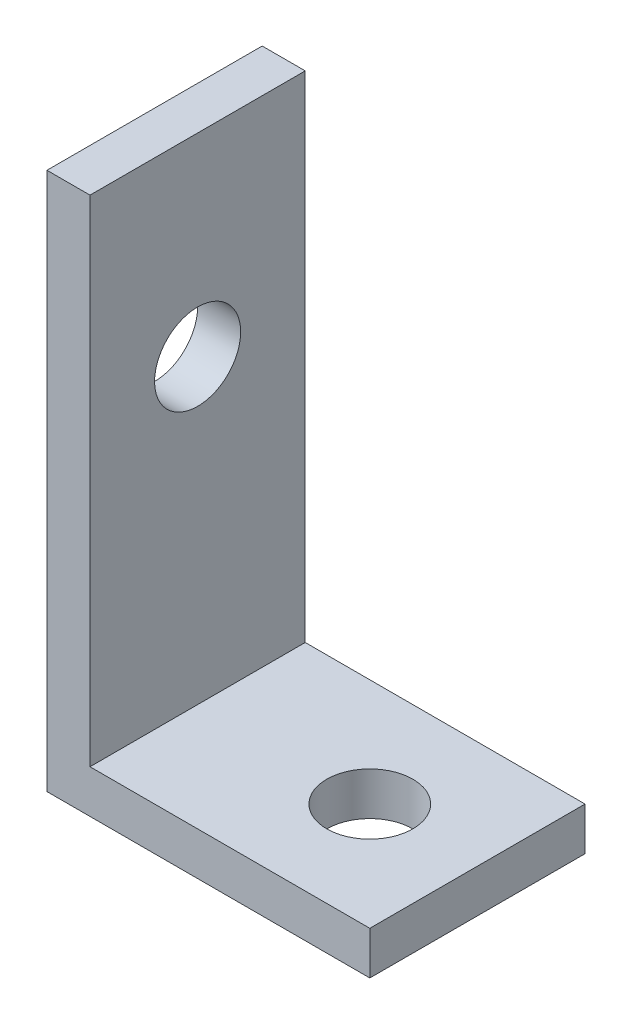
ISO-10303-21;
HEADER;
FILE_DESCRIPTION(('STEP AP214'),'2;1');
FILE_NAME('part.step','',(''),(''),'','','');
FILE_SCHEMA(('AUTOMOTIVE_DESIGN { 1 0 10303 214 1 1 1 1 }'));
ENDSEC;
DATA;
#1=APPLICATION_CONTEXT('core data for automotive mechanical design processes');
#2=APPLICATION_PROTOCOL_DEFINITION('international standard','automotive_design',2000,#1);
#3=PRODUCT_CONTEXT('',#1,'mechanical');
#4=PRODUCT('Part','Part','',(#3));
#5=PRODUCT_RELATED_PRODUCT_CATEGORY('part','',(#4));
#6=PRODUCT_DEFINITION_FORMATION('','',#4);
#7=PRODUCT_DEFINITION_CONTEXT('part definition',#1,'design');
#8=PRODUCT_DEFINITION('design','',#6,#7);
#9=PRODUCT_DEFINITION_SHAPE('','',#8);
#10=(LENGTH_UNIT() NAMED_UNIT(*) SI_UNIT(.MILLI.,.METRE.));
#11=(NAMED_UNIT(*) PLANE_ANGLE_UNIT() SI_UNIT($,.RADIAN.));
#12=(NAMED_UNIT(*) SI_UNIT($,.STERADIAN.) SOLID_ANGLE_UNIT());
#13=UNCERTAINTY_MEASURE_WITH_UNIT(LENGTH_MEASURE(1.E-05),#10,'distance_accuracy_value','');
#14=(GEOMETRIC_REPRESENTATION_CONTEXT(3) GLOBAL_UNCERTAINTY_ASSIGNED_CONTEXT((#13)) GLOBAL_UNIT_ASSIGNED_CONTEXT((#10,
#11,#12)) REPRESENTATION_CONTEXT('',''));
#15=CARTESIAN_POINT('',(0.,0.,0.));
#16=DIRECTION('',(0.,0.,1.));
#17=DIRECTION('',(1.,0.,0.));
#18=AXIS2_PLACEMENT_3D('',#15,#16,#17);
#19=CARTESIAN_POINT('',(15.,0.,10.));
#20=DIRECTION('',(0.,1.,0.));
#21=DIRECTION('',(-1.,0.,0.));
#22=AXIS2_PLACEMENT_3D('',#19,#20,#21);
#23=PLANE('',#22);
#24=CARTESIAN_POINT('',(10.,0.,5.));
#25=DIRECTION('',(0.,1.,0.));
#26=DIRECTION('',(-1.,0.,0.));
#27=AXIS2_PLACEMENT_3D('',#24,#25,#26);
#28=CIRCLE('',#27,2.);
#29=CARTESIAN_POINT('',(8.,0.,5.));
#30=VERTEX_POINT('',#29);
#31=EDGE_CURVE('E124',#30,#30,#28,.T.);
#32=ORIENTED_EDGE('',*,*,#31,.T.);
#33=EDGE_LOOP('',(#32));
#34=FACE_BOUND('',#33,.T.);
#35=DIRECTION('',(1.,0.,0.));
#36=VECTOR('',#35,1.);
#37=CARTESIAN_POINT('',(15.,0.,0.));
#38=LINE('',#37,#36);
#39=CARTESIAN_POINT('',(0.,0.,0.));
#40=VERTEX_POINT('',#39);
#41=CARTESIAN_POINT('',(15.,0.,0.));
#42=VERTEX_POINT('',#41);
#43=EDGE_CURVE('E120',#40,#42,#38,.T.);
#44=ORIENTED_EDGE('',*,*,#43,.T.);
#45=DIRECTION('',(0.,0.,-1.));
#46=VECTOR('',#45,1.);
#47=CARTESIAN_POINT('',(15.,0.,10.));
#48=LINE('',#47,#46);
#49=CARTESIAN_POINT('',(15.,0.,10.));
#50=VERTEX_POINT('',#49);
#51=EDGE_CURVE('E11',#50,#42,#48,.T.);
#52=ORIENTED_EDGE('',*,*,#51,.F.);
#53=DIRECTION('',(1.,0.,0.));
#54=VECTOR('',#53,1.);
#55=CARTESIAN_POINT('',(15.,0.,10.));
#56=LINE('',#55,#54);
#57=CARTESIAN_POINT('',(0.,0.,10.));
#58=VERTEX_POINT('',#57);
#59=EDGE_CURVE('E131',#58,#50,#56,.T.);
#60=ORIENTED_EDGE('',*,*,#59,.F.);
#61=DIRECTION('',(0.,0.,-1.));
#62=VECTOR('',#61,1.);
#63=CARTESIAN_POINT('',(0.,0.,10.));
#64=LINE('',#63,#62);
#65=EDGE_CURVE('E116',#58,#40,#64,.T.);
#66=ORIENTED_EDGE('',*,*,#65,.T.);
#67=EDGE_LOOP('',(#44,#52,#60,#66));
#68=FACE_BOUND('',#67,.T.);
#69=ADVANCED_FACE('F35',(#34,#68),#23,.F.);
#70=CARTESIAN_POINT('',(15.,2.,10.));
#71=DIRECTION('',(-1.,0.,0.));
#72=DIRECTION('',(0.,0.,1.));
#73=AXIS2_PLACEMENT_3D('',#70,#71,#72);
#74=PLANE('',#73);
#75=DIRECTION('',(0.,1.,0.));
#76=VECTOR('',#75,1.);
#77=CARTESIAN_POINT('',(15.,2.,0.));
#78=LINE('',#77,#76);
#79=CARTESIAN_POINT('',(15.,2.,0.));
#80=VERTEX_POINT('',#79);
#81=EDGE_CURVE('E123',#42,#80,#78,.T.);
#82=ORIENTED_EDGE('',*,*,#81,.T.);
#83=DIRECTION('',(0.,0.,-1.));
#84=VECTOR('',#83,1.);
#85=CARTESIAN_POINT('',(15.,2.,10.));
#86=LINE('',#85,#84);
#87=CARTESIAN_POINT('',(15.,2.,10.));
#88=VERTEX_POINT('',#87);
#89=EDGE_CURVE('E44',#88,#80,#86,.T.);
#90=ORIENTED_EDGE('',*,*,#89,.F.);
#91=DIRECTION('',(0.,1.,0.));
#92=VECTOR('',#91,1.);
#93=CARTESIAN_POINT('',(15.,2.,10.));
#94=LINE('',#93,#92);
#95=EDGE_CURVE('E89',#50,#88,#94,.T.);
#96=ORIENTED_EDGE('',*,*,#95,.F.);
#97=ORIENTED_EDGE('',*,*,#51,.T.);
#98=EDGE_LOOP('',(#82,#90,#96,#97));
#99=FACE_BOUND('',#98,.T.);
#100=ADVANCED_FACE('F158',(#99),#74,.F.);
#101=CARTESIAN_POINT('',(2.,2.,10.));
#102=DIRECTION('',(0.,-1.,0.));
#103=DIRECTION('',(1.,0.,0.));
#104=AXIS2_PLACEMENT_3D('',#101,#102,#103);
#105=PLANE('',#104);
#106=CARTESIAN_POINT('',(10.,2.,5.));
#107=DIRECTION('',(0.,1.,0.));
#108=DIRECTION('',(-1.,0.,0.));
#109=AXIS2_PLACEMENT_3D('',#106,#107,#108);
#110=CIRCLE('',#109,2.);
#111=CARTESIAN_POINT('',(8.,2.,5.));
#112=VERTEX_POINT('',#111);
#113=EDGE_CURVE('E166',#112,#112,#110,.T.);
#114=ORIENTED_EDGE('',*,*,#113,.F.);
#115=EDGE_LOOP('',(#114));
#116=FACE_BOUND('',#115,.T.);
#117=DIRECTION('',(-1.,0.,0.));
#118=VECTOR('',#117,1.);
#119=CARTESIAN_POINT('',(2.,2.,0.));
#120=LINE('',#119,#118);
#121=CARTESIAN_POINT('',(2.,2.,0.));
#122=VERTEX_POINT('',#121);
#123=EDGE_CURVE('E126',#80,#122,#120,.T.);
#124=ORIENTED_EDGE('',*,*,#123,.T.);
#125=DIRECTION('',(0.,0.,-1.));
#126=VECTOR('',#125,1.);
#127=CARTESIAN_POINT('',(2.,2.,10.));
#128=LINE('',#127,#126);
#129=CARTESIAN_POINT('',(2.,2.,10.));
#130=VERTEX_POINT('',#129);
#131=EDGE_CURVE('E111',#130,#122,#128,.T.);
#132=ORIENTED_EDGE('',*,*,#131,.F.);
#133=DIRECTION('',(-1.,0.,0.));
#134=VECTOR('',#133,1.);
#135=CARTESIAN_POINT('',(2.,2.,10.));
#136=LINE('',#135,#134);
#137=EDGE_CURVE('E102',#88,#130,#136,.T.);
#138=ORIENTED_EDGE('',*,*,#137,.F.);
#139=ORIENTED_EDGE('',*,*,#89,.T.);
#140=EDGE_LOOP('',(#124,#132,#138,#139));
#141=FACE_BOUND('',#140,.T.);
#142=ADVANCED_FACE('F138',(#116,#141),#105,.F.);
#143=CARTESIAN_POINT('',(2.,25.,10.));
#144=DIRECTION('',(-1.,0.,0.));
#145=DIRECTION('',(0.,-1.,0.));
#146=AXIS2_PLACEMENT_3D('',#143,#144,#145);
#147=PLANE('',#146);
#148=CARTESIAN_POINT('',(2.,16.,5.));
#149=DIRECTION('',(1.,0.,0.));
#150=DIRECTION('',(0.,1.,0.));
#151=AXIS2_PLACEMENT_3D('',#148,#149,#150);
#152=CIRCLE('',#151,2.);
#153=CARTESIAN_POINT('',(2.,18.,5.));
#154=VERTEX_POINT('',#153);
#155=EDGE_CURVE('E173',#154,#154,#152,.T.);
#156=ORIENTED_EDGE('',*,*,#155,.F.);
#157=EDGE_LOOP('',(#156));
#158=FACE_BOUND('',#157,.T.);
#159=DIRECTION('',(0.,1.,0.));
#160=VECTOR('',#159,1.);
#161=CARTESIAN_POINT('',(2.,25.,0.));
#162=LINE('',#161,#160);
#163=CARTESIAN_POINT('',(2.,25.,0.));
#164=VERTEX_POINT('',#163);
#165=EDGE_CURVE('E110',#122,#164,#162,.T.);
#166=ORIENTED_EDGE('',*,*,#165,.T.);
#167=DIRECTION('',(0.,0.,-1.));
#168=VECTOR('',#167,1.);
#169=CARTESIAN_POINT('',(2.,25.,10.));
#170=LINE('',#169,#168);
#171=CARTESIAN_POINT('',(2.,25.,10.));
#172=VERTEX_POINT('',#171);
#173=EDGE_CURVE('E107',#172,#164,#170,.T.);
#174=ORIENTED_EDGE('',*,*,#173,.F.);
#175=DIRECTION('',(0.,1.,0.));
#176=VECTOR('',#175,1.);
#177=CARTESIAN_POINT('',(2.,25.,10.));
#178=LINE('',#177,#176);
#179=EDGE_CURVE('E96',#130,#172,#178,.T.);
#180=ORIENTED_EDGE('',*,*,#179,.F.);
#181=ORIENTED_EDGE('',*,*,#131,.T.);
#182=EDGE_LOOP('',(#166,#174,#180,#181));
#183=FACE_BOUND('',#182,.T.);
#184=ADVANCED_FACE('F108',(#158,#183),#147,.F.);
#185=CARTESIAN_POINT('',(0.,25.,10.));
#186=DIRECTION('',(0.,-1.,0.));
#187=DIRECTION('',(0.,0.,-1.));
#188=AXIS2_PLACEMENT_3D('',#185,#186,#187);
#189=PLANE('',#188);
#190=DIRECTION('',(-1.,0.,0.));
#191=VECTOR('',#190,1.);
#192=CARTESIAN_POINT('',(0.,25.,0.));
#193=LINE('',#192,#191);
#194=CARTESIAN_POINT('',(0.,25.,0.));
#195=VERTEX_POINT('',#194);
#196=EDGE_CURVE('E75',#164,#195,#193,.T.);
#197=ORIENTED_EDGE('',*,*,#196,.T.);
#198=DIRECTION('',(0.,0.,-1.));
#199=VECTOR('',#198,1.);
#200=CARTESIAN_POINT('',(0.,25.,10.));
#201=LINE('',#200,#199);
#202=CARTESIAN_POINT('',(0.,25.,10.));
#203=VERTEX_POINT('',#202);
#204=EDGE_CURVE('E112',#203,#195,#201,.T.);
#205=ORIENTED_EDGE('',*,*,#204,.F.);
#206=DIRECTION('',(-1.,0.,0.));
#207=VECTOR('',#206,1.);
#208=CARTESIAN_POINT('',(0.,25.,10.));
#209=LINE('',#208,#207);
#210=EDGE_CURVE('E100',#172,#203,#209,.T.);
#211=ORIENTED_EDGE('',*,*,#210,.F.);
#212=ORIENTED_EDGE('',*,*,#173,.T.);
#213=EDGE_LOOP('',(#197,#205,#211,#212));
#214=FACE_BOUND('',#213,.T.);
#215=ADVANCED_FACE('F114',(#214),#189,.F.);
#216=CARTESIAN_POINT('',(0.,0.,10.));
#217=DIRECTION('',(1.,0.,0.));
#218=DIRECTION('',(0.,0.,-1.));
#219=AXIS2_PLACEMENT_3D('',#216,#217,#218);
#220=PLANE('',#219);
#221=CARTESIAN_POINT('',(0.,16.,5.));
#222=DIRECTION('',(1.,0.,0.));
#223=DIRECTION('',(0.,0.,-1.));
#224=AXIS2_PLACEMENT_3D('',#221,#222,#223);
#225=CIRCLE('',#224,2.);
#226=CARTESIAN_POINT('',(0.,16.,3.));
#227=VERTEX_POINT('',#226);
#228=EDGE_CURVE('E38',#227,#227,#225,.T.);
#229=ORIENTED_EDGE('',*,*,#228,.T.);
#230=EDGE_LOOP('',(#229));
#231=FACE_BOUND('',#230,.T.);
#232=DIRECTION('',(0.,-1.,0.));
#233=VECTOR('',#232,1.);
#234=CARTESIAN_POINT('',(0.,0.,0.));
#235=LINE('',#234,#233);
#236=EDGE_CURVE('E81',#195,#40,#235,.T.);
#237=ORIENTED_EDGE('',*,*,#236,.T.);
#238=ORIENTED_EDGE('',*,*,#65,.F.);
#239=DIRECTION('',(0.,-1.,0.));
#240=VECTOR('',#239,1.);
#241=CARTESIAN_POINT('',(0.,0.,10.));
#242=LINE('',#241,#240);
#243=EDGE_CURVE('E52',#203,#58,#242,.T.);
#244=ORIENTED_EDGE('',*,*,#243,.F.);
#245=ORIENTED_EDGE('',*,*,#204,.T.);
#246=EDGE_LOOP('',(#237,#238,#244,#245));
#247=FACE_BOUND('',#246,.T.);
#248=ADVANCED_FACE('F145',(#231,#247),#220,.F.);
#249=CARTESIAN_POINT('',(0.,0.,10.));
#250=DIRECTION('',(0.,0.,-1.));
#251=DIRECTION('',(-1.,0.,0.));
#252=AXIS2_PLACEMENT_3D('',#249,#250,#251);
#253=PLANE('',#252);
#254=ORIENTED_EDGE('',*,*,#59,.T.);
#255=ORIENTED_EDGE('',*,*,#95,.T.);
#256=ORIENTED_EDGE('',*,*,#137,.T.);
#257=ORIENTED_EDGE('',*,*,#179,.T.);
#258=ORIENTED_EDGE('',*,*,#210,.T.);
#259=ORIENTED_EDGE('',*,*,#243,.T.);
#260=EDGE_LOOP('',(#254,#255,#256,#257,#258,#259));
#261=FACE_BOUND('',#260,.T.);
#262=ADVANCED_FACE('F98',(#261),#253,.F.);
#263=CARTESIAN_POINT('',(0.,0.,0.));
#264=DIRECTION('',(0.,0.,-1.));
#265=DIRECTION('',(-1.,0.,0.));
#266=AXIS2_PLACEMENT_3D('',#263,#264,#265);
#267=PLANE('',#266);
#268=ORIENTED_EDGE('',*,*,#43,.F.);
#269=ORIENTED_EDGE('',*,*,#236,.F.);
#270=ORIENTED_EDGE('',*,*,#196,.F.);
#271=ORIENTED_EDGE('',*,*,#165,.F.);
#272=ORIENTED_EDGE('',*,*,#123,.F.);
#273=ORIENTED_EDGE('',*,*,#81,.F.);
#274=EDGE_LOOP('',(#268,#269,#270,#271,#272,#273));
#275=FACE_BOUND('',#274,.T.);
#276=ADVANCED_FACE('F141',(#275),#267,.T.);
#277=CARTESIAN_POINT('',(10.,-8.,5.));
#278=DIRECTION('',(0.,1.,0.));
#279=DIRECTION('',(-1.,0.,0.));
#280=AXIS2_PLACEMENT_3D('',#277,#278,#279);
#281=CYLINDRICAL_SURFACE('',#280,2.);
#282=ORIENTED_EDGE('',*,*,#113,.T.);
#283=EDGE_LOOP('',(#282));
#284=FACE_BOUND('',#283,.T.);
#285=ORIENTED_EDGE('',*,*,#31,.F.);
#286=EDGE_LOOP('',(#285));
#287=FACE_BOUND('',#286,.T.);
#288=ADVANCED_FACE('F181',(#284,#287),#281,.F.);
#289=CARTESIAN_POINT('',(-8.,16.,5.));
#290=DIRECTION('',(1.,0.,0.));
#291=DIRECTION('',(0.,1.,0.));
#292=AXIS2_PLACEMENT_3D('',#289,#290,#291);
#293=CYLINDRICAL_SURFACE('',#292,2.);
#294=ORIENTED_EDGE('',*,*,#155,.T.);
#295=EDGE_LOOP('',(#294));
#296=FACE_BOUND('',#295,.T.);
#297=ORIENTED_EDGE('',*,*,#228,.F.);
#298=EDGE_LOOP('',(#297));
#299=FACE_BOUND('',#298,.T.);
#300=ADVANCED_FACE('F179',(#296,#299),#293,.F.);
#301=CLOSED_SHELL('',(#69,#100,#142,#184,#215,#248,#262,#276,#288,#300));
#302=MANIFOLD_SOLID_BREP('B2',#301);
#303=ADVANCED_BREP_SHAPE_REPRESENTATION('',(#18,#302),#14);
#304=SHAPE_DEFINITION_REPRESENTATION(#9,#303);
ENDSEC;
END-ISO-10303-21;
